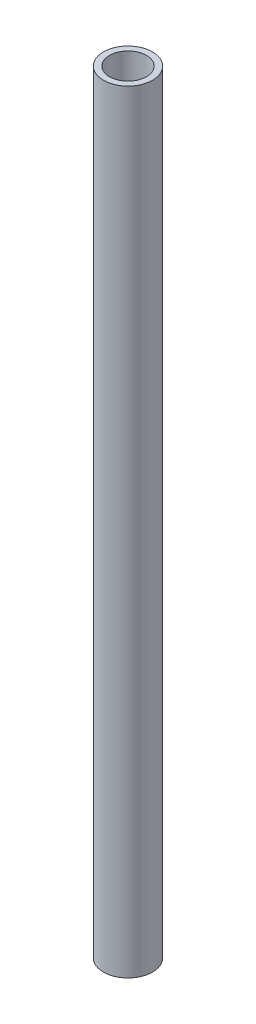
ISO-10303-21;
HEADER;
FILE_DESCRIPTION(('STEP AP214'),'2;1');
FILE_NAME('part.step','',(''),(''),'','','');
FILE_SCHEMA(('AUTOMOTIVE_DESIGN { 1 0 10303 214 1 1 1 1 }'));
ENDSEC;
DATA;
#1=APPLICATION_CONTEXT('core data for automotive mechanical design processes');
#2=APPLICATION_PROTOCOL_DEFINITION('international standard','automotive_design',2000,#1);
#3=PRODUCT_CONTEXT('',#1,'mechanical');
#4=PRODUCT('Part','Part','',(#3));
#5=PRODUCT_RELATED_PRODUCT_CATEGORY('part','',(#4));
#6=PRODUCT_DEFINITION_FORMATION('','',#4);
#7=PRODUCT_DEFINITION_CONTEXT('part definition',#1,'design');
#8=PRODUCT_DEFINITION('design','',#6,#7);
#9=PRODUCT_DEFINITION_SHAPE('','',#8);
#10=(LENGTH_UNIT() NAMED_UNIT(*) SI_UNIT(.MILLI.,.METRE.));
#11=(NAMED_UNIT(*) PLANE_ANGLE_UNIT() SI_UNIT($,.RADIAN.));
#12=(NAMED_UNIT(*) SI_UNIT($,.STERADIAN.) SOLID_ANGLE_UNIT());
#13=UNCERTAINTY_MEASURE_WITH_UNIT(LENGTH_MEASURE(1.E-05),#10,'distance_accuracy_value','');
#14=(GEOMETRIC_REPRESENTATION_CONTEXT(3) GLOBAL_UNCERTAINTY_ASSIGNED_CONTEXT((#13)) GLOBAL_UNIT_ASSIGNED_CONTEXT((#10,
#11,#12)) REPRESENTATION_CONTEXT('',''));
#15=CARTESIAN_POINT('',(0.,0.,0.));
#16=DIRECTION('',(0.,0.,1.));
#17=DIRECTION('',(1.,0.,0.));
#18=AXIS2_PLACEMENT_3D('',#15,#16,#17);
#19=CARTESIAN_POINT('',(0.,530.,0.));
#20=DIRECTION('',(0.,1.,0.));
#21=DIRECTION('',(0.,0.,1.));
#22=AXIS2_PLACEMENT_3D('',#19,#20,#21);
#23=PLANE('',#22);
#24=CARTESIAN_POINT('',(0.,530.,0.));
#25=DIRECTION('',(0.,1.,0.));
#26=DIRECTION('',(0.,0.,1.));
#27=AXIS2_PLACEMENT_3D('',#24,#25,#26);
#28=CIRCLE('',#27,16.85);
#29=CARTESIAN_POINT('',(0.,530.,16.85));
#30=VERTEX_POINT('',#29);
#31=EDGE_CURVE('E10',#30,#30,#28,.T.);
#32=ORIENTED_EDGE('',*,*,#31,.T.);
#33=EDGE_LOOP('',(#32));
#34=FACE_BOUND('',#33,.T.);
#35=CARTESIAN_POINT('',(0.,530.,0.));
#36=DIRECTION('',(0.,1.,0.));
#37=DIRECTION('',(0.,0.,1.));
#38=AXIS2_PLACEMENT_3D('',#35,#36,#37);
#39=CIRCLE('',#38,12.7);
#40=CARTESIAN_POINT('',(0.,530.,12.7));
#41=VERTEX_POINT('',#40);
#42=EDGE_CURVE('E50',#41,#41,#39,.T.);
#43=ORIENTED_EDGE('',*,*,#42,.F.);
#44=EDGE_LOOP('',(#43));
#45=FACE_BOUND('',#44,.T.);
#46=ADVANCED_FACE('F37',(#34,#45),#23,.T.);
#47=CARTESIAN_POINT('',(0.,0.,0.));
#48=DIRECTION('',(0.,1.,0.));
#49=DIRECTION('',(0.,0.,1.));
#50=AXIS2_PLACEMENT_3D('',#47,#48,#49);
#51=PLANE('',#50);
#52=CARTESIAN_POINT('',(0.,0.,0.));
#53=DIRECTION('',(0.,1.,0.));
#54=DIRECTION('',(0.,0.,1.));
#55=AXIS2_PLACEMENT_3D('',#52,#53,#54);
#56=CIRCLE('',#55,16.85);
#57=CARTESIAN_POINT('',(0.,0.,16.85));
#58=VERTEX_POINT('',#57);
#59=EDGE_CURVE('E41',#58,#58,#56,.T.);
#60=ORIENTED_EDGE('',*,*,#59,.F.);
#61=EDGE_LOOP('',(#60));
#62=FACE_BOUND('',#61,.T.);
#63=CARTESIAN_POINT('',(0.,0.,0.));
#64=DIRECTION('',(0.,1.,0.));
#65=DIRECTION('',(0.,0.,1.));
#66=AXIS2_PLACEMENT_3D('',#63,#64,#65);
#67=CIRCLE('',#66,12.7);
#68=CARTESIAN_POINT('',(0.,0.,12.7));
#69=VERTEX_POINT('',#68);
#70=EDGE_CURVE('E52',#69,#69,#67,.T.);
#71=ORIENTED_EDGE('',*,*,#70,.T.);
#72=EDGE_LOOP('',(#71));
#73=FACE_BOUND('',#72,.T.);
#74=ADVANCED_FACE('F64',(#62,#73),#51,.F.);
#75=CARTESIAN_POINT('',(0.,530.,0.));
#76=DIRECTION('',(0.,-1.,0.));
#77=DIRECTION('',(0.,0.,-1.));
#78=AXIS2_PLACEMENT_3D('',#75,#76,#77);
#79=CYLINDRICAL_SURFACE('',#78,16.85);
#80=ORIENTED_EDGE('',*,*,#31,.F.);
#81=EDGE_LOOP('',(#80));
#82=FACE_BOUND('',#81,.T.);
#83=ORIENTED_EDGE('',*,*,#59,.T.);
#84=EDGE_LOOP('',(#83));
#85=FACE_BOUND('',#84,.T.);
#86=ADVANCED_FACE('F39',(#82,#85),#79,.T.);
#87=CARTESIAN_POINT('',(0.,530.,0.));
#88=DIRECTION('',(0.,-1.,0.));
#89=DIRECTION('',(0.,0.,-1.));
#90=AXIS2_PLACEMENT_3D('',#87,#88,#89);
#91=CYLINDRICAL_SURFACE('',#90,12.7);
#92=ORIENTED_EDGE('',*,*,#42,.T.);
#93=EDGE_LOOP('',(#92));
#94=FACE_BOUND('',#93,.T.);
#95=ORIENTED_EDGE('',*,*,#70,.F.);
#96=EDGE_LOOP('',(#95));
#97=FACE_BOUND('',#96,.T.);
#98=ADVANCED_FACE('F60',(#94,#97),#91,.F.);
#99=CLOSED_SHELL('',(#46,#74,#86,#98));
#100=MANIFOLD_SOLID_BREP('B2',#99);
#101=ADVANCED_BREP_SHAPE_REPRESENTATION('',(#18,#100),#14);
#102=SHAPE_DEFINITION_REPRESENTATION(#9,#101);
ENDSEC;
END-ISO-10303-21;
